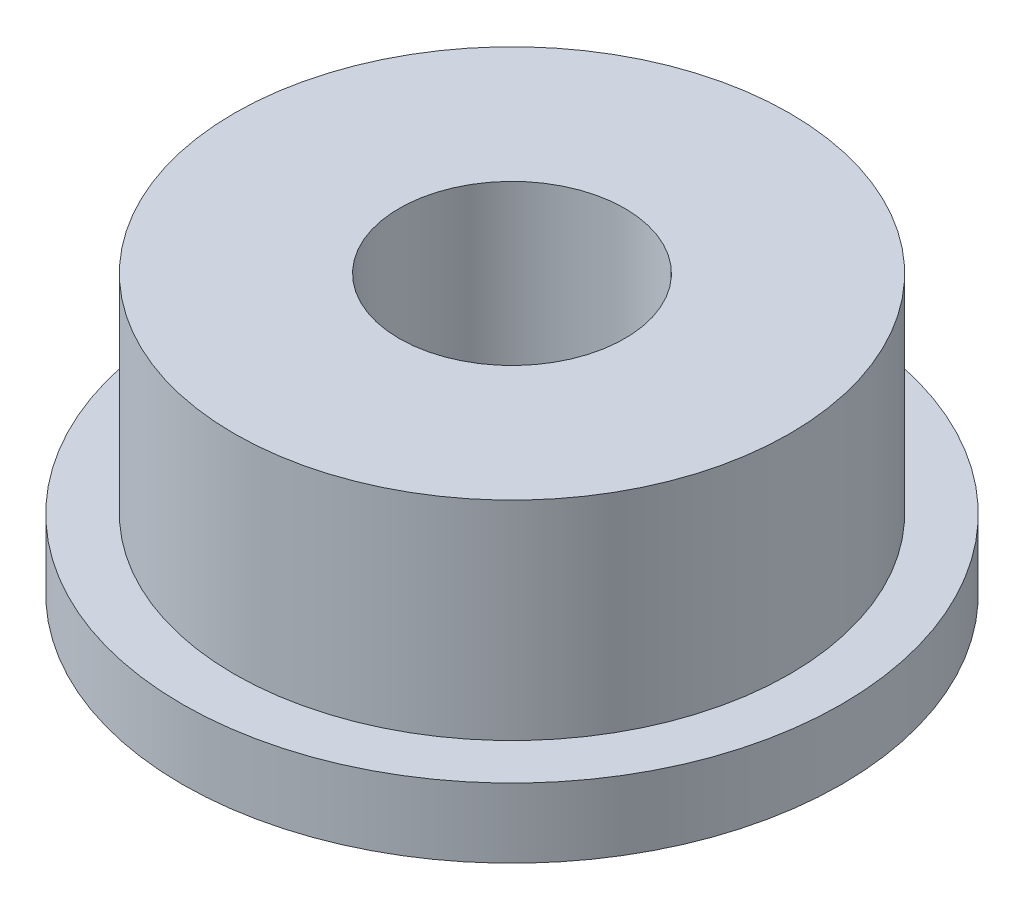
ISO-10303-21;
HEADER;
FILE_DESCRIPTION(('STEP AP214'),'2;1');
FILE_NAME('part.step','',(''),(''),'','','');
FILE_SCHEMA(('AUTOMOTIVE_DESIGN { 1 0 10303 214 1 1 1 1 }'));
ENDSEC;
DATA;
#1=APPLICATION_CONTEXT('core data for automotive mechanical design processes');
#2=APPLICATION_PROTOCOL_DEFINITION('international standard','automotive_design',2000,#1);
#3=PRODUCT_CONTEXT('',#1,'mechanical');
#4=PRODUCT('Part','Part','',(#3));
#5=PRODUCT_RELATED_PRODUCT_CATEGORY('part','',(#4));
#6=PRODUCT_DEFINITION_FORMATION('','',#4);
#7=PRODUCT_DEFINITION_CONTEXT('part definition',#1,'design');
#8=PRODUCT_DEFINITION('design','',#6,#7);
#9=PRODUCT_DEFINITION_SHAPE('','',#8);
#10=(LENGTH_UNIT() NAMED_UNIT(*) SI_UNIT(.MILLI.,.METRE.));
#11=(NAMED_UNIT(*) PLANE_ANGLE_UNIT() SI_UNIT($,.RADIAN.));
#12=(NAMED_UNIT(*) SI_UNIT($,.STERADIAN.) SOLID_ANGLE_UNIT());
#13=UNCERTAINTY_MEASURE_WITH_UNIT(LENGTH_MEASURE(1.E-05),#10,'distance_accuracy_value','');
#14=(GEOMETRIC_REPRESENTATION_CONTEXT(3) GLOBAL_UNCERTAINTY_ASSIGNED_CONTEXT((#13)) GLOBAL_UNIT_ASSIGNED_CONTEXT((#10,
#11,#12)) REPRESENTATION_CONTEXT('',''));
#15=CARTESIAN_POINT('',(0.,0.,0.));
#16=DIRECTION('',(0.,0.,1.));
#17=DIRECTION('',(1.,0.,0.));
#18=AXIS2_PLACEMENT_3D('',#15,#16,#17);
#19=CARTESIAN_POINT('',(0.,1.,0.));
#20=DIRECTION('',(0.,1.,0.));
#21=DIRECTION('',(0.,0.,1.));
#22=AXIS2_PLACEMENT_3D('',#19,#20,#21);
#23=PLANE('',#22);
#24=CARTESIAN_POINT('',(0.,1.,0.));
#25=DIRECTION('',(0.,1.,0.));
#26=DIRECTION('',(0.,0.,1.));
#27=AXIS2_PLACEMENT_3D('',#24,#25,#26);
#28=CIRCLE('',#27,4.);
#29=CARTESIAN_POINT('',(0.,1.,4.));
#30=VERTEX_POINT('',#29);
#31=EDGE_CURVE('E11',#30,#30,#28,.T.);
#32=ORIENTED_EDGE('',*,*,#31,.F.);
#33=EDGE_LOOP('',(#32));
#34=FACE_BOUND('',#33,.T.);
#35=CARTESIAN_POINT('',(0.,1.,0.));
#36=DIRECTION('',(0.,1.,0.));
#37=DIRECTION('',(0.,0.,1.));
#38=AXIS2_PLACEMENT_3D('',#35,#36,#37);
#39=CIRCLE('',#38,4.75);
#40=CARTESIAN_POINT('',(0.,1.,4.75));
#41=VERTEX_POINT('',#40);
#42=EDGE_CURVE('E47',#41,#41,#39,.T.);
#43=ORIENTED_EDGE('',*,*,#42,.T.);
#44=EDGE_LOOP('',(#43));
#45=FACE_BOUND('',#44,.T.);
#46=ADVANCED_FACE('F39',(#34,#45),#23,.T.);
#47=CARTESIAN_POINT('',(0.,0.,0.));
#48=DIRECTION('',(0.,1.,0.));
#49=DIRECTION('',(0.,0.,1.));
#50=AXIS2_PLACEMENT_3D('',#47,#48,#49);
#51=PLANE('',#50);
#52=CARTESIAN_POINT('',(0.,0.,0.));
#53=DIRECTION('',(0.,1.,0.));
#54=DIRECTION('',(0.,0.,1.));
#55=AXIS2_PLACEMENT_3D('',#52,#53,#54);
#56=CIRCLE('',#55,4.75);
#57=CARTESIAN_POINT('',(0.,0.,4.75));
#58=VERTEX_POINT('',#57);
#59=EDGE_CURVE('E43',#58,#58,#56,.T.);
#60=ORIENTED_EDGE('',*,*,#59,.F.);
#61=EDGE_LOOP('',(#60));
#62=FACE_BOUND('',#61,.T.);
#63=CARTESIAN_POINT('',(0.,0.,0.));
#64=DIRECTION('',(0.,1.,0.));
#65=DIRECTION('',(0.,0.,1.));
#66=AXIS2_PLACEMENT_3D('',#63,#64,#65);
#67=CIRCLE('',#66,1.625);
#68=CARTESIAN_POINT('',(0.,0.,1.625));
#69=VERTEX_POINT('',#68);
#70=EDGE_CURVE('E58',#69,#69,#67,.T.);
#71=ORIENTED_EDGE('',*,*,#70,.T.);
#72=EDGE_LOOP('',(#71));
#73=FACE_BOUND('',#72,.T.);
#74=ADVANCED_FACE('F81',(#62,#73),#51,.F.);
#75=CARTESIAN_POINT('',(0.,1.,0.));
#76=DIRECTION('',(0.,-1.,0.));
#77=DIRECTION('',(0.,0.,-1.));
#78=AXIS2_PLACEMENT_3D('',#75,#76,#77);
#79=CYLINDRICAL_SURFACE('',#78,4.75);
#80=ORIENTED_EDGE('',*,*,#42,.F.);
#81=EDGE_LOOP('',(#80));
#82=FACE_BOUND('',#81,.T.);
#83=ORIENTED_EDGE('',*,*,#59,.T.);
#84=EDGE_LOOP('',(#83));
#85=FACE_BOUND('',#84,.T.);
#86=ADVANCED_FACE('F41',(#82,#85),#79,.T.);
#87=CARTESIAN_POINT('',(0.,1.,0.));
#88=DIRECTION('',(0.,-1.,0.));
#89=DIRECTION('',(0.,0.,-1.));
#90=AXIS2_PLACEMENT_3D('',#87,#88,#89);
#91=CYLINDRICAL_SURFACE('',#90,1.625);
#92=ORIENTED_EDGE('',*,*,#70,.F.);
#93=EDGE_LOOP('',(#92));
#94=FACE_BOUND('',#93,.T.);
#95=CARTESIAN_POINT('',(0.,4.,0.));
#96=DIRECTION('',(0.,1.,0.));
#97=DIRECTION('',(0.,0.,1.));
#98=AXIS2_PLACEMENT_3D('',#95,#96,#97);
#99=CIRCLE('',#98,1.625);
#100=CARTESIAN_POINT('',(0.,4.,1.625));
#101=VERTEX_POINT('',#100);
#102=EDGE_CURVE('E55',#101,#101,#99,.T.);
#103=ORIENTED_EDGE('',*,*,#102,.T.);
#104=EDGE_LOOP('',(#103));
#105=FACE_BOUND('',#104,.T.);
#106=ADVANCED_FACE('F70',(#94,#105),#91,.F.);
#107=CARTESIAN_POINT('',(0.,19.3137084989848,0.));
#108=DIRECTION('',(0.,-1.,0.));
#109=DIRECTION('',(0.,0.,-1.));
#110=AXIS2_PLACEMENT_3D('',#107,#108,#109);
#111=CYLINDRICAL_SURFACE('',#110,4.);
#112=ORIENTED_EDGE('',*,*,#31,.T.);
#113=EDGE_LOOP('',(#112));
#114=FACE_BOUND('',#113,.T.);
#115=CARTESIAN_POINT('',(0.,4.,0.));
#116=DIRECTION('',(0.,1.,0.));
#117=DIRECTION('',(0.,0.,1.));
#118=AXIS2_PLACEMENT_3D('',#115,#116,#117);
#119=CIRCLE('',#118,4.);
#120=CARTESIAN_POINT('',(0.,4.,4.));
#121=VERTEX_POINT('',#120);
#122=EDGE_CURVE('E54',#121,#121,#119,.T.);
#123=ORIENTED_EDGE('',*,*,#122,.F.);
#124=EDGE_LOOP('',(#123));
#125=FACE_BOUND('',#124,.T.);
#126=ADVANCED_FACE('F68',(#114,#125),#111,.T.);
#127=CARTESIAN_POINT('',(0.,4.,0.));
#128=DIRECTION('',(0.,1.,0.));
#129=DIRECTION('',(0.,0.,1.));
#130=AXIS2_PLACEMENT_3D('',#127,#128,#129);
#131=PLANE('',#130);
#132=ORIENTED_EDGE('',*,*,#102,.F.);
#133=EDGE_LOOP('',(#132));
#134=FACE_BOUND('',#133,.T.);
#135=ORIENTED_EDGE('',*,*,#122,.T.);
#136=EDGE_LOOP('',(#135));
#137=FACE_BOUND('',#136,.T.);
#138=ADVANCED_FACE('F66',(#134,#137),#131,.T.);
#139=CLOSED_SHELL('',(#46,#74,#86,#106,#126,#138));
#140=MANIFOLD_SOLID_BREP('B2',#139);
#141=ADVANCED_BREP_SHAPE_REPRESENTATION('',(#18,#140),#14);
#142=SHAPE_DEFINITION_REPRESENTATION(#9,#141);
ENDSEC;
END-ISO-10303-21;
